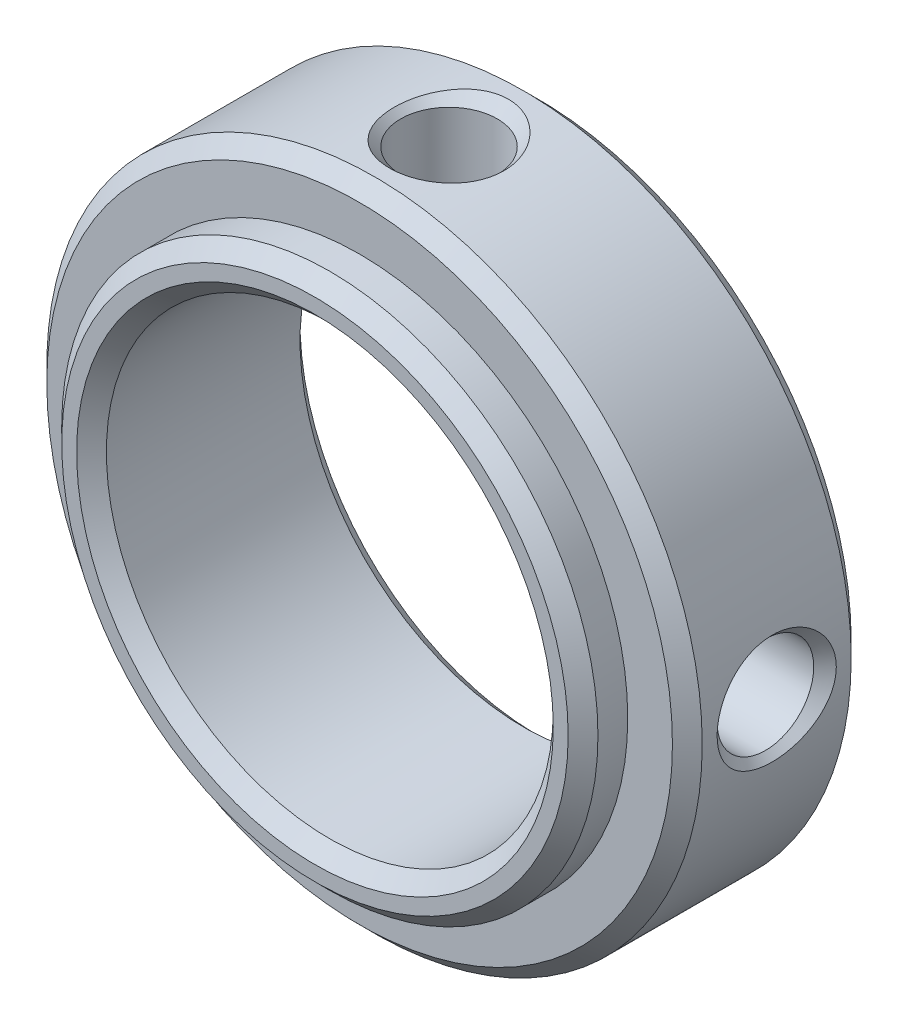
ISO-10303-21;
HEADER;
FILE_DESCRIPTION(('STEP AP214'),'2;1');
FILE_NAME('part.step','',(''),(''),'','','');
FILE_SCHEMA(('AUTOMOTIVE_DESIGN { 1 0 10303 214 1 1 1 1 }'));
ENDSEC;
DATA;
#1=APPLICATION_CONTEXT('core data for automotive mechanical design processes');
#2=APPLICATION_PROTOCOL_DEFINITION('international standard','automotive_design',2000,#1);
#3=PRODUCT_CONTEXT('',#1,'mechanical');
#4=PRODUCT('Part','Part','',(#3));
#5=PRODUCT_RELATED_PRODUCT_CATEGORY('part','',(#4));
#6=PRODUCT_DEFINITION_FORMATION('','',#4);
#7=PRODUCT_DEFINITION_CONTEXT('part definition',#1,'design');
#8=PRODUCT_DEFINITION('design','',#6,#7);
#9=PRODUCT_DEFINITION_SHAPE('','',#8);
#10=(LENGTH_UNIT() NAMED_UNIT(*) SI_UNIT(.MILLI.,.METRE.));
#11=(NAMED_UNIT(*) PLANE_ANGLE_UNIT() SI_UNIT($,.RADIAN.));
#12=(NAMED_UNIT(*) SI_UNIT($,.STERADIAN.) SOLID_ANGLE_UNIT());
#13=UNCERTAINTY_MEASURE_WITH_UNIT(LENGTH_MEASURE(1.E-05),#10,'distance_accuracy_value','');
#14=(GEOMETRIC_REPRESENTATION_CONTEXT(3) GLOBAL_UNCERTAINTY_ASSIGNED_CONTEXT((#13)) GLOBAL_UNIT_ASSIGNED_CONTEXT((#10,
#11,#12)) REPRESENTATION_CONTEXT('',''));
#15=CARTESIAN_POINT('',(0.,0.,0.));
#16=DIRECTION('',(0.,0.,1.));
#17=DIRECTION('',(1.,0.,0.));
#18=AXIS2_PLACEMENT_3D('',#15,#16,#17);
#19=CARTESIAN_POINT('',(0.,0.,-3.));
#20=DIRECTION('',(0.,0.,-1.));
#21=DIRECTION('',(-1.,0.,0.));
#22=AXIS2_PLACEMENT_3D('',#19,#20,#21);
#23=CONICAL_SURFACE('',#22,8.,0.785398163397448);
#24=CARTESIAN_POINT('',(0.,0.,-2.5));
#25=DIRECTION('',(0.,0.,1.));
#26=DIRECTION('',(1.,0.,0.));
#27=AXIS2_PLACEMENT_3D('',#24,#25,#26);
#28=CIRCLE('',#27,7.5);
#29=CARTESIAN_POINT('',(7.5,0.,-2.5));
#30=VERTEX_POINT('',#29);
#31=EDGE_CURVE('E29',#30,#30,#28,.T.);
#32=ORIENTED_EDGE('',*,*,#31,.T.);
#33=EDGE_LOOP('',(#32));
#34=FACE_BOUND('',#33,.T.);
#35=CARTESIAN_POINT('',(0.,0.,-3.));
#36=DIRECTION('',(0.,0.,1.));
#37=DIRECTION('',(1.,0.,0.));
#38=AXIS2_PLACEMENT_3D('',#35,#36,#37);
#39=CIRCLE('',#38,8.);
#40=CARTESIAN_POINT('',(8.,0.,-3.));
#41=VERTEX_POINT('',#40);
#42=EDGE_CURVE('E91',#41,#41,#39,.T.);
#43=ORIENTED_EDGE('',*,*,#42,.F.);
#44=EDGE_LOOP('',(#43));
#45=FACE_BOUND('',#44,.T.);
#46=ADVANCED_FACE('F15',(#34,#45),#23,.F.);
#47=CARTESIAN_POINT('',(0.,0.,4.5));
#48=DIRECTION('',(0.,0.,1.));
#49=DIRECTION('',(1.,0.,0.));
#50=AXIS2_PLACEMENT_3D('',#47,#48,#49);
#51=CYLINDRICAL_SURFACE('',#50,7.5);
#52=CARTESIAN_POINT('',(-1.621,7.32272893121137,0.));
#53=CARTESIAN_POINT('',(-1.62099687236664,7.32273074755098,-0.0899038358625745));
#54=CARTESIAN_POINT('',(-1.61349520286325,7.32440263345071,-0.179845515837992));
#55=CARTESIAN_POINT('',(-1.58371844413528,7.3308975983031,-0.357173021838235));
#56=CARTESIAN_POINT('',(-1.56143251095917,7.33572299024855,-0.444556922626155));
#57=CARTESIAN_POINT('',(-1.50282013140885,7.34795351660353,-0.614178056114049));
#58=CARTESIAN_POINT('',(-1.46650888324879,7.35535585770649,-0.696420748270056));
#59=CARTESIAN_POINT('',(-1.38091985010328,7.37190286922761,-0.853648156121891));
#60=CARTESIAN_POINT('',(-1.33164239719735,7.38104749502218,-0.928633057630876));
#61=CARTESIAN_POINT('',(-1.22065322750415,7.40021725048443,-1.07045492925447));
#62=CARTESIAN_POINT('',(-1.15876811682779,7.41025341748777,-1.137154733643));
#63=CARTESIAN_POINT('',(-1.02469468171418,7.42997873060186,-1.25931229252371));
#64=CARTESIAN_POINT('',(-0.952505568773379,7.4396678500841,-1.31476918587649));
#65=CARTESIAN_POINT('',(-0.798955285124875,7.45772740230315,-1.4134078075145));
#66=CARTESIAN_POINT('',(-0.71750765345234,7.46608329427618,-1.45645783357077));
#67=CARTESIAN_POINT('',(-0.548323405310909,7.48041033248177,-1.5282089369766));
#68=CARTESIAN_POINT('',(-0.46058747884038,7.48638173988661,-1.55691158587922));
#69=CARTESIAN_POINT('',(-0.282742974331054,7.49518899945156,-1.59872239573114));
#70=CARTESIAN_POINT('',(-0.192691303536818,7.49807146720329,-1.61206262991829));
#71=CARTESIAN_POINT('',(-0.0115850834726774,7.50053750692021,-1.62349530622321));
#72=CARTESIAN_POINT('',(0.0794693525241379,7.50012144774877,-1.62158945326035));
#73=CARTESIAN_POINT('',(0.258397295443898,7.4960730092669,-1.60275735457957));
#74=CARTESIAN_POINT('',(0.346298517502574,7.49249419074815,-1.58608123045544));
#75=CARTESIAN_POINT('',(0.518024617183466,7.48258328885811,-1.53858027424522));
#76=CARTESIAN_POINT('',(0.60184931319149,7.47625108294477,-1.50775481242641));
#77=CARTESIAN_POINT('',(0.763739972467913,7.46145845831056,-1.43260746511477));
#78=CARTESIAN_POINT('',(0.841760293571538,7.45298309333397,-1.38819031486463));
#79=CARTESIAN_POINT('',(0.98933138690938,7.43483418327543,-1.28719138842167));
#80=CARTESIAN_POINT('',(1.05888102886029,7.4251604786399,-1.23060799160786));
#81=CARTESIAN_POINT('',(1.18902364998815,7.40544728419828,-1.10551953242376));
#82=CARTESIAN_POINT('',(1.24940588007822,7.39540435600887,-1.03679555870317));
#83=CARTESIAN_POINT('',(1.35782688286461,7.37626912143309,-0.89009346763913));
#84=CARTESIAN_POINT('',(1.4058653367224,7.36717683960542,-0.812115111331925));
#85=CARTESIAN_POINT('',(1.48832577105213,7.35096359644511,-0.648782520034576));
#86=CARTESIAN_POINT('',(1.52270874523353,7.34384829943056,-0.563407992425257));
#87=CARTESIAN_POINT('',(1.57657691503288,7.33247373352837,-0.387902891037021));
#88=CARTESIAN_POINT('',(1.59606441241388,7.3282140233861,-0.297773054386876));
#89=CARTESIAN_POINT('',(1.61926326986101,7.32312270378733,-0.117239257328509));
#90=CARTESIAN_POINT('',(1.62328113417857,7.32222450198077,-0.0268765154705693));
#91=CARTESIAN_POINT('',(1.61625577521256,7.32377838762239,0.153227664366256));
#92=CARTESIAN_POINT('',(1.60521356030278,7.32623025076116,0.242969143538506));
#93=CARTESIAN_POINT('',(1.56864718351558,7.33414519360751,0.41822145313416));
#94=CARTESIAN_POINT('',(1.5432911134889,7.33957330151173,0.503769080808493));
#95=CARTESIAN_POINT('',(1.47899846855692,7.35279770153091,0.669401700714547));
#96=CARTESIAN_POINT('',(1.44006061911023,7.36059421589302,0.749486179429876));
#97=CARTESIAN_POINT('',(1.34903178597356,7.37782373838975,0.903247721167944));
#98=CARTESIAN_POINT('',(1.29675156341682,7.38727962196052,0.976810136907439));
#99=CARTESIAN_POINT('',(1.18077030536178,7.4067017688108,1.11423012816817));
#100=CARTESIAN_POINT('',(1.11706788664852,7.41666809379965,1.17808652656934));
#101=CARTESIAN_POINT('',(0.978665103225349,7.43620719928019,1.29546756476529));
#102=CARTESIAN_POINT('',(0.903785998424953,7.445769544032,1.34878348370804));
#103=CARTESIAN_POINT('',(0.74595612924001,7.46323280070106,1.4420792704132));
#104=CARTESIAN_POINT('',(0.663005737173231,7.47113378920138,1.48205975294522));
#105=CARTESIAN_POINT('',(0.491898378416219,7.48434002033288,1.5472571400718));
#106=CARTESIAN_POINT('',(0.403777863816973,7.48966144552783,1.57256628504769));
#107=CARTESIAN_POINT('',(0.224408131078985,7.49717886050936,1.60799126930778));
#108=CARTESIAN_POINT('',(0.133159358352864,7.49937529336638,1.61810926244856));
#109=CARTESIAN_POINT('',(-0.0478935289421169,7.50038247343381,1.62276980444035));
#110=CARTESIAN_POINT('',(-0.137689379230273,7.49926102762408,1.61762428565347));
#111=CARTESIAN_POINT('',(-0.31510426041437,7.49390334552127,1.59260030460621));
#112=CARTESIAN_POINT('',(-0.402723328632754,7.48966716267067,1.5727220951285));
#113=CARTESIAN_POINT('',(-0.573062893252121,7.47856056394689,1.51894498186718));
#114=CARTESIAN_POINT('',(-0.655797617605823,7.47169828433068,1.48508935806674));
#115=CARTESIAN_POINT('',(-0.814454218365362,7.45607313482181,1.40436102898102));
#116=CARTESIAN_POINT('',(-0.890375449499734,7.44731008518481,1.35748709251489));
#117=CARTESIAN_POINT('',(-1.03477452928929,7.4286369304158,1.25103054851702));
#118=CARTESIAN_POINT('',(-1.10308789851819,7.41870854037186,1.19122802531061));
#119=CARTESIAN_POINT('',(-1.22881638351513,7.39892360597008,1.06105668579895));
#120=CARTESIAN_POINT('',(-1.2862288761733,7.38906707945227,0.990685333563157));
#121=CARTESIAN_POINT('',(-1.38924285771343,7.37039943057237,0.840275180538975));
#122=CARTESIAN_POINT('',(-1.43468127884454,7.36160354680109,0.76012270056957));
#123=CARTESIAN_POINT('',(-1.51137113605772,7.34624385532937,0.593147113198116));
#124=CARTESIAN_POINT('',(-1.542634704209,7.33967814006926,0.506329784863596));
#125=CARTESIAN_POINT('',(-1.5844362734669,7.33075008990193,0.349506511262758));
#126=CARTESIAN_POINT('',(-1.59812163356967,7.32776192602792,0.280357894734531));
#127=CARTESIAN_POINT('',(-1.61640451054976,7.32375068100641,0.140813885918481));
#128=CARTESIAN_POINT('',(-1.62100244976657,7.32272750853564,0.0704185517255065));
#129=CARTESIAN_POINT('',(-1.621,7.32272893121137,0.));
#130=B_SPLINE_CURVE_WITH_KNOTS('',3,(#52,#53,#54,#55,#56,#57,#58,#59,#60,#61,#62,#63,#64,#65,
#66,#67,#68,#69,#70,#71,#72,#73,#74,#75,#76,#77,#78,#79,#80,#81,#82,#83,#84,#85,#86,#87,#88,#89,
#90,#91,#92,#93,#94,#95,#96,#97,#98,#99,#100,#101,#102,#103,#104,#105,#106,#107,#108,#109,#110,
#111,#112,#113,#114,#115,#116,#117,#118,#119,#120,#121,#122,#123,#124,#125,#126,#127,#128,#129),
.UNSPECIFIED.,.T.,.F.,(4,2,2,2,2,2,2,2,2,2,2,2,2,2,2,2,2,2,2,2,2,2,2,2,2,2,2,2,2,2,2,2,2,2,2,2,
2,2,4),(0.,0.269453464649487,0.539104786683699,0.808464723262258,1.07781776189232,
1.35116116499291,1.62452549665166,1.90069294077778,2.17683012801864,2.44873872762555,
2.72061692102029,2.98797728790134,3.25534955512041,3.52464052213471,3.79396738265696,
4.0687677074855,4.34357512966591,4.61916197699945,4.89470622993058,5.16476207561093,
5.43479984012017,5.70173053706739,5.96868629006797,6.23966203816783,6.51067062331217,
6.78660152113874,7.06251969666802,7.33668378321192,7.61080899410578,7.87937090270987,
8.14792820345072,8.41566010089163,8.68341732716756,8.95614875557996,9.2289457292109,
9.50528541314957,9.78138813305378,9.9924514815969,10.2035050207033),.UNSPECIFIED.);
#131=CARTESIAN_POINT('',(-1.621,7.32272893121137,0.));
#132=VERTEX_POINT('',#131);
#133=EDGE_CURVE('E18',#132,#132,#130,.T.);
#134=ORIENTED_EDGE('',*,*,#133,.F.);
#135=EDGE_LOOP('',(#134));
#136=FACE_BOUND('',#135,.T.);
#137=CARTESIAN_POINT('',(7.5,0.,-1.621));
#138=CARTESIAN_POINT('',(7.49999833810788,-0.0899314929735589,-1.62099689238378));
#139=CARTESIAN_POINT('',(7.49836600468388,-0.179900779898295,-1.61349076352164));
#140=CARTESIAN_POINT('',(7.49201193669874,-0.357285594074729,-1.58369468834428));
#141=CARTESIAN_POINT('',(7.48728795915008,-0.444699219056534,-1.56139400842282));
#142=CARTESIAN_POINT('',(7.47527679942892,-0.614383330214406,-1.50273852208998));
#143=CARTESIAN_POINT('',(7.46799226375417,-0.696659023758527,-1.46639822267946));
#144=CARTESIAN_POINT('',(7.45164700786165,-0.853942151469209,-1.38074069125602));
#145=CARTESIAN_POINT('',(7.44258634209633,-0.92894980835336,-1.33142385706084));
#146=CARTESIAN_POINT('',(7.42352312985904,-1.07074776011569,-1.22039416184727));
#147=CARTESIAN_POINT('',(7.41350913151168,-1.13740768843006,-1.15851675897419));
#148=CARTESIAN_POINT('',(7.39374895765789,-1.25948777986185,-1.02447570877459));
#149=CARTESIAN_POINT('',(7.38400280565095,-1.3149069594768,-0.952311162320491));
#150=CARTESIAN_POINT('',(7.36576906987366,-1.41350468468729,-0.79878415689914));
#151=CARTESIAN_POINT('',(7.35729616931915,-1.45654498916367,-0.717331017651804));
#152=CARTESIAN_POINT('',(7.34273240064218,-1.52827662247175,-0.548134883630957));
#153=CARTESIAN_POINT('',(7.33664125492316,-1.55696962360866,-0.460392623273924));
#154=CARTESIAN_POINT('',(7.32764718154206,-1.59876240233554,-0.282521467454403));
#155=CARTESIAN_POINT('',(7.32469717288754,-1.61209270189128,-0.192449166898616));
#156=CARTESIAN_POINT('',(7.32217794011491,-1.62349835014945,-0.0113020157484732));
#157=CARTESIAN_POINT('',(7.32260831057539,-1.62157552821508,0.0797727133126032));
#158=CARTESIAN_POINT('',(7.32675856369929,-1.60271515061745,0.258629624380841));
#159=CARTESIAN_POINT('',(7.33041988576599,-1.58604487732737,0.346441555505378));
#160=CARTESIAN_POINT('',(7.3405269706189,-1.53858603715042,0.517992159963854));
#161=CARTESIAN_POINT('',(7.34697288631347,-1.50779669494774,0.601730609332677));
#162=CARTESIAN_POINT('',(7.36198088338595,-1.43272689280511,0.763511319124397));
#163=CARTESIAN_POINT('',(7.37055905841154,-1.38834320624575,0.841504125054169));
#164=CARTESIAN_POINT('',(7.38885509403028,-1.28741722368653,0.989034080557055));
#165=CARTESIAN_POINT('',(7.39857310642592,-1.23087330736069,1.05857010134573));
#166=CARTESIAN_POINT('',(7.41830545309564,-1.10581475820065,1.18875194586542));
#167=CARTESIAN_POINT('',(7.42832171327747,-1.03707272326524,1.24917923583245));
#168=CARTESIAN_POINT('',(7.44733510256351,-0.890317818144699,1.35768280518281));
#169=CARTESIAN_POINT('',(7.45633221403998,-0.812304787651271,1.40575887095098));
#170=CARTESIAN_POINT('',(7.47232170512563,-0.648959101937615,1.48824732691425));
#171=CARTESIAN_POINT('',(7.47930995227258,-0.563611820936575,1.52263160670113));
#172=CARTESIAN_POINT('',(7.49046353006128,-0.388166457699895,1.57651055026927));
#173=CARTESIAN_POINT('',(7.494629261303,-0.298069051607229,1.59600732708517));
#174=CARTESIAN_POINT('',(7.49961159850132,-0.117555979303208,1.61924118363555));
#175=CARTESIAN_POINT('',(7.50049165140035,-0.0271804463426039,1.623276860089));
#176=CARTESIAN_POINT('',(7.49898104450762,0.152953435739122,1.61628254749559));
#177=CARTESIAN_POINT('',(7.49659060105623,0.242711825289001,1.60525355496293));
#178=CARTESIAN_POINT('',(7.48884758688727,0.418077901607162,1.5686906508059));
#179=CARTESIAN_POINT('',(7.48352691551364,0.503719673274276,1.54331286649004));
#180=CARTESIAN_POINT('',(7.4705187799409,0.669531084522397,1.47894566971032));
#181=CARTESIAN_POINT('',(7.46283111741517,0.749700264875322,1.43995511661648));
#182=CARTESIAN_POINT('',(7.44578499097477,0.903529022984988,1.34884363413632));
#183=CARTESIAN_POINT('',(7.43640465979558,0.977081856415358,1.29654666366321));
#184=CARTESIAN_POINT('',(7.41705926459442,1.11447484877189,1.18053923502465));
#185=CARTESIAN_POINT('',(7.40709412665213,1.17831377616806,1.11682733189873));
#186=CARTESIAN_POINT('',(7.38748385525495,1.29564332826544,0.978429883884926));
#187=CARTESIAN_POINT('',(7.37784768735553,1.34892743267108,0.903567753396743));
#188=CARTESIAN_POINT('',(7.36019117363825,1.44216743094426,0.745781652404031));
#189=CARTESIAN_POINT('',(7.35217075849948,1.48212389665801,0.662858027989555));
#190=CARTESIAN_POINT('',(7.33872925368961,1.54730786220703,0.49174471835222));
#191=CARTESIAN_POINT('',(7.33329371463104,1.5726174146328,0.403587481057942));
#192=CARTESIAN_POINT('',(7.32561063740287,1.60803082512366,0.22413919180621));
#193=CARTESIAN_POINT('',(7.32336260323174,1.61813704896452,0.132848629684289));
#194=CARTESIAN_POINT('',(7.32233979570647,1.62275809168936,-0.0481939339952275));
#195=CARTESIAN_POINT('',(7.32349211403651,1.61760018796114,-0.137937325601936));
#196=CARTESIAN_POINT('',(7.32897557201404,1.59256970342796,-0.315243949860029));
#197=CARTESIAN_POINT('',(7.33330667601629,1.57269728762383,-0.402807206946921));
#198=CARTESIAN_POINT('',(7.34462457311079,1.5189583046108,-0.573015407715132));
#199=CARTESIAN_POINT('',(7.35160252469684,1.48513829536009,-0.655675677679699));
#200=CARTESIAN_POINT('',(7.36743155443606,1.40450455189394,-0.814197859648514));
#201=CARTESIAN_POINT('',(7.37628282238814,1.35768950090919,-0.890059081683754));
#202=CARTESIAN_POINT('',(7.39507972326147,1.2513044320779,-1.03444545913128));
#203=CARTESIAN_POINT('',(7.40504352032341,1.19150072078826,-1.10279609525833));
#204=CARTESIAN_POINT('',(7.42481959641205,1.0613108414436,-1.22859920915741));
#205=CARTESIAN_POINT('',(7.43463183992538,0.990922233315806,-1.28604916713674));
#206=CARTESIAN_POINT('',(7.45314577912645,0.840492059252322,-1.38911195136018));
#207=CARTESIAN_POINT('',(7.46183192197475,0.760340028496653,-1.43456648800203));
#208=CARTESIAN_POINT('',(7.47695940792012,0.593363650279832,-1.51128659215852));
#209=CARTESIAN_POINT('',(7.48340265291211,0.506545032475193,-1.54256418803111));
#210=CARTESIAN_POINT('',(7.49215397209867,0.349686283256488,-1.58439839201087));
#211=CARTESIAN_POINT('',(7.49507815419989,0.28050148245364,-1.59809805708761));
#212=CARTESIAN_POINT('',(7.49900177836725,0.140885484504292,-1.61639988568959));
#213=CARTESIAN_POINT('',(7.5000013019634,0.0704543402814229,-1.62100243457596));
#214=CARTESIAN_POINT('',(7.5,0.,-1.621));
#215=B_SPLINE_CURVE_WITH_KNOTS('',3,(#137,#138,#139,#140,#141,#142,#143,#144,#145,#146,#147,
#148,#149,#150,#151,#152,#153,#154,#155,#156,#157,#158,#159,#160,#161,#162,#163,#164,#165,#166,
#167,#168,#169,#170,#171,#172,#173,#174,#175,#176,#177,#178,#179,#180,#181,#182,#183,#184,#185,
#186,#187,#188,#189,#190,#191,#192,#193,#194,#195,#196,#197,#198,#199,#200,#201,#202,#203,#204,
#205,#206,#207,#208,#209,#210,#211,#212,#213,#214),.UNSPECIFIED.,.T.,.F.,(4,2,2,2,2,2,2,2,2,2,2,
2,2,2,2,2,2,2,2,2,2,2,2,2,2,2,2,2,2,2,2,2,2,2,2,2,2,2,4),(0.,0.269536609268199,0.53926898442066,
0.808723389996911,1.07816953595238,1.35140416439622,1.62466268903518,1.90086382679384,
2.17703276335587,2.44900141443264,2.7209374477977,2.98804364100945,3.25516450349304,
3.52436622180582,3.79360383295227,4.06852218633743,4.34344529413179,4.6189299678167,
4.89437553374024,5.1644738498514,5.43455430006884,5.70175108298497,5.96897026001094,
6.23992735296159,6.51091876930952,6.78677875189212,7.06262689668492,7.33691438490591,
7.61115918709021,7.87956681581584,8.14797143480441,8.41548726221797,8.68303020653547,
8.95585819469173,9.2287491729354,9.50507900860769,9.7811739526583,9.99234389817661,
10.2035048981754),.UNSPECIFIED.);
#216=CARTESIAN_POINT('',(7.5,0.,-1.621));
#217=VERTEX_POINT('',#216);
#218=EDGE_CURVE('E36',#217,#217,#215,.T.);
#219=ORIENTED_EDGE('',*,*,#218,.F.);
#220=EDGE_LOOP('',(#219));
#221=FACE_BOUND('',#220,.T.);
#222=CARTESIAN_POINT('',(0.,0.,4.));
#223=DIRECTION('',(0.,0.,1.));
#224=DIRECTION('',(1.,0.,0.));
#225=AXIS2_PLACEMENT_3D('',#222,#223,#224);
#226=CIRCLE('',#225,7.5);
#227=CARTESIAN_POINT('',(7.5,0.,4.));
#228=VERTEX_POINT('',#227);
#229=EDGE_CURVE('E64',#228,#228,#226,.T.);
#230=ORIENTED_EDGE('',*,*,#229,.T.);
#231=EDGE_LOOP('',(#230));
#232=FACE_BOUND('',#231,.T.);
#233=ORIENTED_EDGE('',*,*,#31,.F.);
#234=EDGE_LOOP('',(#233));
#235=FACE_BOUND('',#234,.T.);
#236=ADVANCED_FACE('F104',(#136,#221,#232,#235),#51,.F.);
#237=CARTESIAN_POINT('',(0.,0.,4.));
#238=DIRECTION('',(0.,0.,1.));
#239=DIRECTION('',(1.,0.,0.));
#240=AXIS2_PLACEMENT_3D('',#237,#238,#239);
#241=CONICAL_SURFACE('',#240,7.5,0.78539816339745);
#242=CARTESIAN_POINT('',(0.,0.,4.5));
#243=DIRECTION('',(0.,0.,1.));
#244=DIRECTION('',(1.,0.,0.));
#245=AXIS2_PLACEMENT_3D('',#242,#243,#244);
#246=CIRCLE('',#245,8.);
#247=CARTESIAN_POINT('',(8.,0.,4.5));
#248=VERTEX_POINT('',#247);
#249=EDGE_CURVE('E67',#248,#248,#246,.T.);
#250=ORIENTED_EDGE('',*,*,#249,.T.);
#251=EDGE_LOOP('',(#250));
#252=FACE_BOUND('',#251,.T.);
#253=ORIENTED_EDGE('',*,*,#229,.F.);
#254=EDGE_LOOP('',(#253));
#255=FACE_BOUND('',#254,.T.);
#256=ADVANCED_FACE('F107',(#252,#255),#241,.F.);
#257=CARTESIAN_POINT('',(8.,0.,4.5));
#258=DIRECTION('',(0.,0.,1.));
#259=DIRECTION('',(1.,0.,0.));
#260=AXIS2_PLACEMENT_3D('',#257,#258,#259);
#261=PLANE('',#260);
#262=CARTESIAN_POINT('',(0.,0.,4.5));
#263=DIRECTION('',(0.,0.,1.));
#264=DIRECTION('',(1.,0.,0.));
#265=AXIS2_PLACEMENT_3D('',#262,#263,#264);
#266=CIRCLE('',#265,8.5);
#267=CARTESIAN_POINT('',(8.5,0.,4.5));
#268=VERTEX_POINT('',#267);
#269=EDGE_CURVE('E70',#268,#268,#266,.T.);
#270=ORIENTED_EDGE('',*,*,#269,.T.);
#271=EDGE_LOOP('',(#270));
#272=FACE_BOUND('',#271,.T.);
#273=ORIENTED_EDGE('',*,*,#249,.F.);
#274=EDGE_LOOP('',(#273));
#275=FACE_BOUND('',#274,.T.);
#276=ADVANCED_FACE('F154',(#272,#275),#261,.T.);
#277=CARTESIAN_POINT('',(0.,0.,4.5));
#278=DIRECTION('',(0.,0.,-1.));
#279=DIRECTION('',(-1.,0.,0.));
#280=AXIS2_PLACEMENT_3D('',#277,#278,#279);
#281=CONICAL_SURFACE('',#280,8.5,0.785398163397448);
#282=CARTESIAN_POINT('',(0.,0.,4.));
#283=DIRECTION('',(0.,0.,1.));
#284=DIRECTION('',(1.,0.,0.));
#285=AXIS2_PLACEMENT_3D('',#282,#283,#284);
#286=CIRCLE('',#285,9.);
#287=CARTESIAN_POINT('',(9.,0.,4.));
#288=VERTEX_POINT('',#287);
#289=EDGE_CURVE('E73',#288,#288,#286,.T.);
#290=ORIENTED_EDGE('',*,*,#289,.T.);
#291=EDGE_LOOP('',(#290));
#292=FACE_BOUND('',#291,.T.);
#293=ORIENTED_EDGE('',*,*,#269,.F.);
#294=EDGE_LOOP('',(#293));
#295=FACE_BOUND('',#294,.T.);
#296=ADVANCED_FACE('F148',(#292,#295),#281,.T.);
#297=CARTESIAN_POINT('',(0.,0.,4.5));
#298=DIRECTION('',(0.,0.,1.));
#299=DIRECTION('',(1.,0.,0.));
#300=AXIS2_PLACEMENT_3D('',#297,#298,#299);
#301=CYLINDRICAL_SURFACE('',#300,9.);
#302=CARTESIAN_POINT('',(0.,0.,3.));
#303=DIRECTION('',(0.,0.,1.));
#304=DIRECTION('',(1.,0.,0.));
#305=AXIS2_PLACEMENT_3D('',#302,#303,#304);
#306=CIRCLE('',#305,9.);
#307=CARTESIAN_POINT('',(9.,0.,3.));
#308=VERTEX_POINT('',#307);
#309=EDGE_CURVE('E76',#308,#308,#306,.T.);
#310=ORIENTED_EDGE('',*,*,#309,.T.);
#311=EDGE_LOOP('',(#310));
#312=FACE_BOUND('',#311,.T.);
#313=ORIENTED_EDGE('',*,*,#289,.F.);
#314=EDGE_LOOP('',(#313));
#315=FACE_BOUND('',#314,.T.);
#316=ADVANCED_FACE('F142',(#312,#315),#301,.T.);
#317=CARTESIAN_POINT('',(9.,0.,3.));
#318=DIRECTION('',(0.,0.,1.));
#319=DIRECTION('',(1.,0.,0.));
#320=AXIS2_PLACEMENT_3D('',#317,#318,#319);
#321=PLANE('',#320);
#322=CARTESIAN_POINT('',(0.,0.,3.));
#323=DIRECTION('',(0.,0.,1.));
#324=DIRECTION('',(1.,0.,0.));
#325=AXIS2_PLACEMENT_3D('',#322,#323,#324);
#326=CIRCLE('',#325,10.5);
#327=CARTESIAN_POINT('',(10.5,0.,3.));
#328=VERTEX_POINT('',#327);
#329=EDGE_CURVE('E79',#328,#328,#326,.T.);
#330=ORIENTED_EDGE('',*,*,#329,.T.);
#331=EDGE_LOOP('',(#330));
#332=FACE_BOUND('',#331,.T.);
#333=ORIENTED_EDGE('',*,*,#309,.F.);
#334=EDGE_LOOP('',(#333));
#335=FACE_BOUND('',#334,.T.);
#336=ADVANCED_FACE('F137',(#332,#335),#321,.T.);
#337=CARTESIAN_POINT('',(0.,0.,3.));
#338=DIRECTION('',(0.,0.,-1.));
#339=DIRECTION('',(-1.,0.,0.));
#340=AXIS2_PLACEMENT_3D('',#337,#338,#339);
#341=CONICAL_SURFACE('',#340,10.5,0.785398163397448);
#342=CARTESIAN_POINT('',(0.,0.,2.5));
#343=DIRECTION('',(0.,0.,1.));
#344=DIRECTION('',(1.,0.,0.));
#345=AXIS2_PLACEMENT_3D('',#342,#343,#344);
#346=CIRCLE('',#345,11.);
#347=CARTESIAN_POINT('',(11.,0.,2.5));
#348=VERTEX_POINT('',#347);
#349=EDGE_CURVE('E82',#348,#348,#346,.T.);
#350=ORIENTED_EDGE('',*,*,#349,.T.);
#351=EDGE_LOOP('',(#350));
#352=FACE_BOUND('',#351,.T.);
#353=ORIENTED_EDGE('',*,*,#329,.F.);
#354=EDGE_LOOP('',(#353));
#355=FACE_BOUND('',#354,.T.);
#356=ADVANCED_FACE('F131',(#352,#355),#341,.T.);
#357=CARTESIAN_POINT('',(0.,0.,4.5));
#358=DIRECTION('',(0.,0.,1.));
#359=DIRECTION('',(1.,0.,0.));
#360=AXIS2_PLACEMENT_3D('',#357,#358,#359);
#361=CYLINDRICAL_SURFACE('',#360,11.);
#362=CARTESIAN_POINT('',(-1.3492836294301,10.9169333537251,-1.36164133675904));
#363=CARTESIAN_POINT('',(-1.41082061310597,10.9093279613915,-1.28995341706873));
#364=CARTESIAN_POINT('',(-1.46717263206603,10.901835997752,-1.21377965180805));
#365=CARTESIAN_POINT('',(-1.56872798879297,10.8876868843545,-1.05421309908477));
#366=CARTESIAN_POINT('',(-1.6139213068992,10.8810304874886,-0.970813913848449));
#367=CARTESIAN_POINT('',(-1.70032591409093,10.8678966837175,-0.7814884598093));
#368=CARTESIAN_POINT('',(-1.73898584691012,10.8617145364246,-0.674367176046878));
#369=CARTESIAN_POINT('',(-1.79874902797684,10.8519777328353,-0.455208955130269));
#370=CARTESIAN_POINT('',(-1.81984482476393,10.8484241917778,-0.343169952866298));
#371=CARTESIAN_POINT('',(-1.84459652874375,10.8442443972488,-0.112561317286336));
#372=CARTESIAN_POINT('',(-1.84751904774362,10.8437412633565,0.00609001827912036));
#373=CARTESIAN_POINT('',(-1.8339073147683,10.8460512655655,0.242242107148554));
#374=CARTESIAN_POINT('',(-1.8173717302247,10.8488646287937,0.359742781094944));
#375=CARTESIAN_POINT('',(-1.76487464354884,10.8575286903505,0.591500523965542));
#376=CARTESIAN_POINT('',(-1.72871433368389,10.863410448919,0.705711577053104));
#377=CARTESIAN_POINT('',(-1.63751227396604,10.8775306169766,0.926207074252609));
#378=CARTESIAN_POINT('',(-1.58246966494144,10.8857691336988,1.0324911574081));
#379=CARTESIAN_POINT('',(-1.45586168167135,10.9034149895592,1.23167852201217));
#380=CARTESIAN_POINT('',(-1.38464441572207,10.9127960058526,1.32480477085175));
#381=CARTESIAN_POINT('',(-1.22662907151176,10.9316827197757,1.49676703477197));
#382=CARTESIAN_POINT('',(-1.13983629294287,10.9411883739799,1.57560789228976));
#383=CARTESIAN_POINT('',(-0.9585464620262,10.9585107940693,1.71141087832306));
#384=CARTESIAN_POINT('',(-0.864833029461631,10.9663949395353,1.76940797607905));
#385=CARTESIAN_POINT('',(-0.668205522194958,10.9801262623692,1.86718691795925));
#386=CARTESIAN_POINT('',(-0.565298036155137,10.9859748839559,1.9069816830944));
#387=CARTESIAN_POINT('',(-0.362905167730333,10.9944373614955,1.96370433556059));
#388=CARTESIAN_POINT('',(-0.263901900711497,10.9972885163603,1.98232145950467));
#389=CARTESIAN_POINT('',(-0.0641342153755352,11.0002657186349,2.00175085113628));
#390=CARTESIAN_POINT('',(0.0366294889716554,11.0003928462627,2.00257017657573));
#391=CARTESIAN_POINT('',(0.230937864609057,10.9979806882912,1.98684462979057));
#392=CARTESIAN_POINT('',(0.324566474761897,10.9955930774793,1.97128752089055));
#393=CARTESIAN_POINT('',(0.507901413741853,10.9886512173872,1.92501839829064));
#394=CARTESIAN_POINT('',(0.597607665536063,10.9840969255755,1.89430608709653));
#395=CARTESIAN_POINT('',(0.771949077889507,10.9732325079528,1.81847886442203));
#396=CARTESIAN_POINT('',(0.856504039450177,10.9669005221812,1.77318353953957));
#397=CARTESIAN_POINT('',(1.01740084693456,10.9531469340918,1.66996219354784));
#398=CARTESIAN_POINT('',(1.09374054446384,10.9457250479457,1.61203288042199));
#399=CARTESIAN_POINT('',(1.24168469261407,10.9299649840931,1.48099225874179));
#400=CARTESIAN_POINT('',(1.31260397897597,10.9215988831267,1.40711156759953));
#401=CARTESIAN_POINT('',(1.44214359242645,10.9052507710546,1.2492287907593));
#402=CARTESIAN_POINT('',(1.50075956761839,10.8972688966233,1.16522314017029));
#403=CARTESIAN_POINT('',(1.60899414031821,10.8818369584083,0.98213347869874));
#404=CARTESIAN_POINT('',(1.6574933824812,10.8744829315144,0.882378815157412));
#405=CARTESIAN_POINT('',(1.73819699961907,10.8618757063704,0.676358720147819));
#406=CARTESIAN_POINT('',(1.77039683802939,10.8566230930857,0.570091485270995));
#407=CARTESIAN_POINT('',(1.81930188866519,10.8485391071754,0.347692490768041));
#408=CARTESIAN_POINT('',(1.83503948254352,10.8458596293027,0.231341459118881));
#409=CARTESIAN_POINT('',(1.84746138788251,10.8437504951471,-0.00240869310170386));
#410=CARTESIAN_POINT('',(1.84414275689591,10.8443213407425,-0.119807972737352));
#411=CARTESIAN_POINT('',(1.81824191363019,10.8486945547927,-0.354860967114986));
#412=CARTESIAN_POINT('',(1.79526509722108,10.8525631132862,-0.472470299266981));
#413=CARTESIAN_POINT('',(1.72994389162694,10.863166245689,-0.70207057036993));
#414=CARTESIAN_POINT('',(1.68759799737371,10.8699010423155,-0.81406107196082));
#415=CARTESIAN_POINT('',(1.58480026213746,10.8853606205722,-1.02805750197134));
#416=CARTESIAN_POINT('',(1.52451097664203,10.8940673750676,-1.13014259823741));
#417=CARTESIAN_POINT('',(1.38689253222609,10.9124392139516,-1.3220445934458));
#418=CARTESIAN_POINT('',(1.30956624652403,10.9221041365983,-1.41186355688749));
#419=CARTESIAN_POINT('',(1.14355419936728,10.9407002764389,-1.57200753859684));
#420=CARTESIAN_POINT('',(1.055551983829,10.9496448149119,-1.64303763052559));
#421=CARTESIAN_POINT('',(0.867887061725606,10.9661116697563,-1.76775862679924));
#422=CARTESIAN_POINT('',(0.768231967442821,10.9736349062876,-1.82146076542802));
#423=CARTESIAN_POINT('',(0.568980893389442,10.9856896860779,-1.90522662894712));
#424=CARTESIAN_POINT('',(0.470066042413365,10.9904176606209,-1.93688195154097));
#425=CARTESIAN_POINT('',(0.268070547236925,10.9971959982428,-1.98181899189524));
#426=CARTESIAN_POINT('',(0.164992333350724,10.9992479008083,-1.99511127377887));
#427=CARTESIAN_POINT('',(-0.0341775269000487,11.0003644475378,-2.00236840844775));
#428=CARTESIAN_POINT('',(-0.130221024692109,10.999639138965,-1.99769216678217));
#429=CARTESIAN_POINT('',(-0.320097670323392,10.9957515843987,-1.97223983581264));
#430=CARTESIAN_POINT('',(-0.41393079884194,10.9925893171121,-1.95146360583361));
#431=CARTESIAN_POINT('',(-0.595691533925438,10.9842317342697,-1.89506333538895));
#432=CARTESIAN_POINT('',(-0.683675083819792,10.9790604645868,-1.85961459443566));
#433=CARTESIAN_POINT('',(-0.85278496098809,10.9672214650055,-1.77527627062267));
#434=CARTESIAN_POINT('',(-0.933913320691089,10.960554180804,-1.72639068993153));
#435=CARTESIAN_POINT('',(-1.07326784022272,10.9476960012809,-1.62710734649395));
#436=CARTESIAN_POINT('',(-1.13294121319186,10.9416487677843,-1.57869789880167));
#437=CARTESIAN_POINT('',(-1.24597526216931,10.9293538705181,-1.47505681126315));
#438=CARTESIAN_POINT('',(-1.29933729912539,10.9231062503297,-1.4198266474751));
#439=CARTESIAN_POINT('',(-1.3492836294301,10.9169333537251,-1.36164133675904));
#440=B_SPLINE_CURVE_WITH_KNOTS('',3,(#362,#363,#364,#365,#366,#367,#368,#369,#370,#371,#372,
#373,#374,#375,#376,#377,#378,#379,#380,#381,#382,#383,#384,#385,#386,#387,#388,#389,#390,#391,
#392,#393,#394,#395,#396,#397,#398,#399,#400,#401,#402,#403,#404,#405,#406,#407,#408,#409,#410,
#411,#412,#413,#414,#415,#416,#417,#418,#419,#420,#421,#422,#423,#424,#425,#426,#427,#428,#429,
#430,#431,#432,#433,#434,#435,#436,#437,#438,#439),.UNSPECIFIED.,.T.,.F.,(4,2,2,2,2,2,2,2,2,2,2,
2,2,2,2,2,2,2,2,2,2,2,2,2,2,2,2,2,2,2,2,2,2,2,2,2,2,2,4),(0.,0.284144737053099,
0.568543694019487,0.909138581252306,1.2498778899353,1.60428309550878,1.95871257357439,
2.31680149737037,2.67490671688783,3.02593335170585,3.37684077260235,3.70652161075111,
4.0359680588356,4.33673148506304,4.6373756407852,4.9208714853045,5.2043728950237,
5.49152586352725,5.77875374457214,6.0857057482171,6.39276614387071,6.72479776007347,
7.05692173890555,7.40762623800704,7.75838489039678,8.1163541821208,8.47435129446477,
8.82919909778646,9.18398710326208,9.52250506178835,9.8608031048992,10.171032440834,
10.4810832296709,10.7681641056421,11.0552474900358,11.3389956648036,11.6226594164659,
11.853334574758,12.0839599002688),.UNSPECIFIED.);
#441=CARTESIAN_POINT('',(-1.3492836294301,10.9169333537251,-1.36164133675904));
#442=VERTEX_POINT('',#441);
#443=EDGE_CURVE('E10',#442,#442,#440,.T.);
#444=ORIENTED_EDGE('',*,*,#443,.F.);
#445=EDGE_LOOP('',(#444));
#446=FACE_BOUND('',#445,.T.);
#447=CARTESIAN_POINT('',(10.9169333537251,-1.3492836294301,-1.36164133675904));
#448=CARTESIAN_POINT('',(10.9245530019425,-1.28763020891823,-1.4334635687449));
#449=CARTESIAN_POINT('',(10.9322882654621,-1.22075987030891,-1.50079542389781));
#450=CARTESIAN_POINT('',(10.9473250223153,-1.0776139844693,-1.62472483469979));
#451=CARTESIAN_POINT('',(10.9546263936283,-1.00133580991041,-1.68131938048635));
#452=CARTESIAN_POINT('',(10.9689630661688,-0.830690933601631,-1.78831612408063));
#453=CARTESIAN_POINT('',(10.9758502386167,-0.73525539142715,-1.83705234514816));
#454=CARTESIAN_POINT('',(10.987333726128,-0.536967135339002,-1.91638301250983));
#455=CARTESIAN_POINT('',(10.9919305296956,-0.434116008429719,-1.94698132763556));
#456=CARTESIAN_POINT('',(10.9979660907136,-0.232601429203861,-1.98682487819857));
#457=CARTESIAN_POINT('',(10.999622905258,-0.134235611938899,-1.99754743189414));
#458=CARTESIAN_POINT('',(11.0002612744429,0.0628487258756453,-2.00169966828308));
#459=CARTESIAN_POINT('',(10.9992437804628,0.161567108523318,-1.99513550068844));
#460=CARTESIAN_POINT('',(10.994759385023,0.352087421169566,-1.96570252138775));
#461=CARTESIAN_POINT('',(10.9914000496321,0.444004002977928,-1.94354934167154));
#462=CARTESIAN_POINT('',(10.9827132316743,0.622928752094632,-1.88466576059149));
#463=CARTESIAN_POINT('',(10.977385565366,0.70993646029101,-1.84793399831014));
#464=CARTESIAN_POINT('',(10.9651384192008,0.879291982159531,-1.76009248161161));
#465=CARTESIAN_POINT('',(10.95817906234,0.961444893885135,-1.7086138625223));
#466=CARTESIAN_POINT('',(10.9434520059558,1.11666880785923,-1.59353217295876));
#467=CARTESIAN_POINT('',(10.9356840689246,1.18973712774099,-1.52992553547808));
#468=CARTESIAN_POINT('',(10.91947364256,1.33060194651987,-1.38729640873683));
#469=CARTESIAN_POINT('',(10.9110244091405,1.39758701562771,-1.30747370464519));
#470=CARTESIAN_POINT('',(10.8948734838491,1.51837201839215,-1.13834756635124));
#471=CARTESIAN_POINT('',(10.8871720538268,1.57216734353262,-1.04904083399053));
#472=CARTESIAN_POINT('',(10.8727061180064,1.66939361702229,-0.855960812826056));
#473=CARTESIAN_POINT('',(10.8660622870933,1.71168237015708,-0.751602300792311));
#474=CARTESIAN_POINT('',(10.8552091934386,1.77921511836991,-0.537388063760143));
#475=CARTESIAN_POINT('',(10.8510005396669,1.80445485022708,-0.427530971176052));
#476=CARTESIAN_POINT('',(10.8453275230539,1.83825708045086,-0.199780367594584));
#477=CARTESIAN_POINT('',(10.8440050697042,1.84595796602349,-0.0817546098708775));
#478=CARTESIAN_POINT('',(10.8446752294324,1.84201531125067,0.153972728344987));
#479=CARTESIAN_POINT('',(10.8466682915824,1.83036915043171,0.271674262759567));
#480=CARTESIAN_POINT('',(10.8537922104751,1.78764329318848,0.505111769705904));
#481=CARTESIAN_POINT('',(10.8589664003714,1.75629508290003,0.620797504848872));
#482=CARTESIAN_POINT('',(10.8718784175853,1.67450416847216,0.845087740512293));
#483=CARTESIAN_POINT('',(10.8796163810388,1.62406045034374,0.953691864633635));
#484=CARTESIAN_POINT('',(10.8965813978255,1.50598931560626,1.15876202937177));
#485=CARTESIAN_POINT('',(10.9057834230875,1.43864132097158,1.25539056486859));
#486=CARTESIAN_POINT('',(10.9246220910018,1.28778401358574,1.4350761795156));
#487=CARTESIAN_POINT('',(10.9342586146092,1.20427910715088,1.51813694750579));
#488=CARTESIAN_POINT('',(10.9521812428183,1.0281583760273,1.66316447030301));
#489=CARTESIAN_POINT('',(10.9605125144066,0.936299069493632,1.72604197365366));
#490=CARTESIAN_POINT('',(10.9753439475268,0.742450866283122,1.83384071665843));
#491=CARTESIAN_POINT('',(10.9818453874743,0.640469109395114,1.8787745019672));
#492=CARTESIAN_POINT('',(10.991667854423,0.43878897708191,1.94537241061149));
#493=CARTESIAN_POINT('',(10.9952150148313,0.339653703338093,1.96871068963676));
#494=CARTESIAN_POINT('',(10.9995825069418,0.138762431033379,1.99733586242584));
#495=CARTESIAN_POINT('',(11.0004040862891,0.0370076530634258,2.00263101553023));
#496=CARTESIAN_POINT('',(10.9992571106704,-0.159265247059289,1.99516635815852));
#497=CARTESIAN_POINT('',(10.9974637089404,-0.253829835730805,1.98354005169613));
#498=CARTESIAN_POINT('',(10.9916040237122,-0.439639882439299,1.94478798014853));
#499=CARTESIAN_POINT('',(10.9875377879026,-0.530885410073849,1.91766254026503));
#500=CARTESIAN_POINT('',(10.9775511699732,-0.708012198589074,1.84890928535629));
#501=CARTESIAN_POINT('',(10.9716235805266,-0.793871024234921,1.80722502563323));
#502=CARTESIAN_POINT('',(10.9585236759017,-0.957882759615537,1.71093019273322));
#503=CARTESIAN_POINT('',(10.9513510649761,-1.03603383148686,1.65631654713407));
#504=CARTESIAN_POINT('',(10.9359638282758,-1.18780743391777,1.53206601261953));
#505=CARTESIAN_POINT('',(10.9277119134438,-1.26082245384056,1.46169267558282));
#506=CARTESIAN_POINT('',(10.9113869777536,-1.39506904041343,1.3104762718214));
#507=CARTESIAN_POINT('',(10.9033140212188,-1.45629642908405,1.22962950984376));
#508=CARTESIAN_POINT('',(10.8874760370435,-1.57049907425967,1.05262067850729));
#509=CARTESIAN_POINT('',(10.8797909099146,-1.62238184163125,0.955745908720806));
#510=CARTESIAN_POINT('',(10.8663152686239,-1.71031467591766,0.754939751179029));
#511=CARTESIAN_POINT('',(10.860525280107,-1.74636035112721,0.651006415261344));
#512=CARTESIAN_POINT('',(10.8511532988235,-1.80371254864939,0.432313935597797));
#513=CARTESIAN_POINT('',(10.8477254165241,-1.82399979028957,0.317279856955769));
#514=CARTESIAN_POINT('',(10.8440462162424,-1.84574726345934,0.0853792452506699));
#515=CARTESIAN_POINT('',(10.8437957098349,-1.84720268491132,-0.0314877483493127));
#516=CARTESIAN_POINT('',(10.8465343756946,-1.83105518173748,-0.266779729988322));
#517=CARTESIAN_POINT('',(10.8496039419659,-1.8129793273459,-0.385171613970132));
#518=CARTESIAN_POINT('',(10.8587528262646,-1.757349291331,-0.617157413610948));
#519=CARTESIAN_POINT('',(10.8648312260283,-1.71980105230386,-0.730752781642917));
#520=CARTESIAN_POINT('',(10.8782769928062,-1.6324061134053,-0.934728263926785));
#521=CARTESIAN_POINT('',(10.8853539469303,-1.58494704933204,-1.02615749478288));
#522=CARTESIAN_POINT('',(10.9005535685022,-1.47678999633799,-1.20069274553543));
#523=CARTESIAN_POINT('',(10.9086755653022,-1.41610048076136,-1.28380404310954));
#524=CARTESIAN_POINT('',(10.9169333537251,-1.3492836294301,-1.36164133675904));
#525=B_SPLINE_CURVE_WITH_KNOTS('',3,(#447,#448,#449,#450,#451,#452,#453,#454,#455,#456,#457,
#458,#459,#460,#461,#462,#463,#464,#465,#466,#467,#468,#469,#470,#471,#472,#473,#474,#475,#476,
#477,#478,#479,#480,#481,#482,#483,#484,#485,#486,#487,#488,#489,#490,#491,#492,#493,#494,#495,
#496,#497,#498,#499,#500,#501,#502,#503,#504,#505,#506,#507,#508,#509,#510,#511,#512,#513,#514,
#515,#516,#517,#518,#519,#520,#521,#522,#523,#524),.UNSPECIFIED.,.T.,.F.,(4,2,2,2,2,2,2,2,2,2,2,
2,2,2,2,2,2,2,2,2,2,2,2,2,2,2,2,2,2,2,2,2,2,2,2,2,2,2,4),(0.,0.284610439828601,
0.569300543626404,0.889683775853779,1.20999864543739,1.50536877947409,1.80063385044922,
2.08316060284238,2.36571373544543,2.65606562909668,2.94650305107334,3.25881322524253,
3.57123236604106,3.90812807900037,4.2451080038127,4.59831505757441,4.95156995560004,
5.30974688840812,5.66794284340876,6.0205685066119,6.37309813687871,6.70618443114877,
7.03903743303215,7.3431515575105,7.64712645335326,7.93165263587434,8.21617284870694,
8.50180862383856,8.78751234312088,9.09145342428699,9.39550203605998,9.72455108168547,
10.0536913167637,10.4026691268161,10.7517360720241,11.1094487039783,11.4670522331231,
11.7756956888186,12.0841420537967),.UNSPECIFIED.);
#526=CARTESIAN_POINT('',(10.9169333537251,-1.3492836294301,-1.36164133675904));
#527=VERTEX_POINT('',#526);
#528=EDGE_CURVE('E25',#527,#527,#525,.T.);
#529=ORIENTED_EDGE('',*,*,#528,.F.);
#530=EDGE_LOOP('',(#529));
#531=FACE_BOUND('',#530,.T.);
#532=CARTESIAN_POINT('',(0.,0.,-2.5));
#533=DIRECTION('',(0.,0.,1.));
#534=DIRECTION('',(1.,0.,0.));
#535=AXIS2_PLACEMENT_3D('',#532,#533,#534);
#536=CIRCLE('',#535,11.);
#537=CARTESIAN_POINT('',(11.,0.,-2.5));
#538=VERTEX_POINT('',#537);
#539=EDGE_CURVE('E85',#538,#538,#536,.T.);
#540=ORIENTED_EDGE('',*,*,#539,.T.);
#541=EDGE_LOOP('',(#540));
#542=FACE_BOUND('',#541,.T.);
#543=ORIENTED_EDGE('',*,*,#349,.F.);
#544=EDGE_LOOP('',(#543));
#545=FACE_BOUND('',#544,.T.);
#546=ADVANCED_FACE('F40',(#446,#531,#542,#545),#361,.T.);
#547=CARTESIAN_POINT('',(0.,0.,-2.5));
#548=DIRECTION('',(0.,0.,1.));
#549=DIRECTION('',(1.,0.,0.));
#550=AXIS2_PLACEMENT_3D('',#547,#548,#549);
#551=CONICAL_SURFACE('',#550,11.,0.785398163397446);
#552=CARTESIAN_POINT('',(0.,0.,-3.));
#553=DIRECTION('',(0.,0.,1.));
#554=DIRECTION('',(1.,0.,0.));
#555=AXIS2_PLACEMENT_3D('',#552,#553,#554);
#556=CIRCLE('',#555,10.5);
#557=CARTESIAN_POINT('',(10.5,0.,-3.));
#558=VERTEX_POINT('',#557);
#559=EDGE_CURVE('E88',#558,#558,#556,.T.);
#560=ORIENTED_EDGE('',*,*,#559,.T.);
#561=EDGE_LOOP('',(#560));
#562=FACE_BOUND('',#561,.T.);
#563=ORIENTED_EDGE('',*,*,#539,.F.);
#564=EDGE_LOOP('',(#563));
#565=FACE_BOUND('',#564,.T.);
#566=ADVANCED_FACE('F122',(#562,#565),#551,.T.);
#567=CARTESIAN_POINT('',(10.5,0.,-3.));
#568=DIRECTION('',(0.,0.,-1.));
#569=DIRECTION('',(-1.,0.,0.));
#570=AXIS2_PLACEMENT_3D('',#567,#568,#569);
#571=PLANE('',#570);
#572=ORIENTED_EDGE('',*,*,#42,.T.);
#573=EDGE_LOOP('',(#572));
#574=FACE_BOUND('',#573,.T.);
#575=ORIENTED_EDGE('',*,*,#559,.F.);
#576=EDGE_LOOP('',(#575));
#577=FACE_BOUND('',#576,.T.);
#578=ADVANCED_FACE('F119',(#574,#577),#571,.T.);
#579=CARTESIAN_POINT('',(11.,0.,0.));
#580=DIRECTION('',(1.,0.,0.));
#581=DIRECTION('',(0.,0.,-1.));
#582=AXIS2_PLACEMENT_3D('',#579,#580,#581);
#583=CYLINDRICAL_SURFACE('',#582,1.621);
#584=ORIENTED_EDGE('',*,*,#218,.T.);
#585=EDGE_LOOP('',(#584));
#586=FACE_BOUND('',#585,.T.);
#587=CARTESIAN_POINT('',(10.621,0.,0.));
#588=DIRECTION('',(1.,0.,0.));
#589=DIRECTION('',(0.,0.,-1.));
#590=AXIS2_PLACEMENT_3D('',#587,#588,#589);
#591=CIRCLE('',#590,1.621);
#592=CARTESIAN_POINT('',(10.621,0.,-1.621));
#593=VERTEX_POINT('',#592);
#594=EDGE_CURVE('E94',#593,#593,#591,.T.);
#595=ORIENTED_EDGE('',*,*,#594,.T.);
#596=EDGE_LOOP('',(#595));
#597=FACE_BOUND('',#596,.T.);
#598=ADVANCED_FACE('F55',(#586,#597),#583,.F.);
#599=CARTESIAN_POINT('',(11.,0.,0.));
#600=DIRECTION('',(1.,0.,0.));
#601=DIRECTION('',(0.,0.,-1.));
#602=AXIS2_PLACEMENT_3D('',#599,#600,#601);
#603=CONICAL_SURFACE('',#602,2.,0.785398163397449);
#604=ORIENTED_EDGE('',*,*,#528,.T.);
#605=EDGE_LOOP('',(#604));
#606=FACE_BOUND('',#605,.T.);
#607=ORIENTED_EDGE('',*,*,#594,.F.);
#608=EDGE_LOOP('',(#607));
#609=FACE_BOUND('',#608,.T.);
#610=ADVANCED_FACE('F51',(#606,#609),#603,.F.);
#611=CARTESIAN_POINT('',(0.,11.,0.));
#612=DIRECTION('',(0.,1.,0.));
#613=DIRECTION('',(-1.,0.,0.));
#614=AXIS2_PLACEMENT_3D('',#611,#612,#613);
#615=CYLINDRICAL_SURFACE('',#614,1.621);
#616=ORIENTED_EDGE('',*,*,#133,.T.);
#617=EDGE_LOOP('',(#616));
#618=FACE_BOUND('',#617,.T.);
#619=CARTESIAN_POINT('',(0.,10.621,0.));
#620=DIRECTION('',(0.,1.,0.));
#621=DIRECTION('',(-1.,0.,0.));
#622=AXIS2_PLACEMENT_3D('',#619,#620,#621);
#623=CIRCLE('',#622,1.621);
#624=CARTESIAN_POINT('',(-1.621,10.621,0.));
#625=VERTEX_POINT('',#624);
#626=EDGE_CURVE('E97',#625,#625,#623,.T.);
#627=ORIENTED_EDGE('',*,*,#626,.T.);
#628=EDGE_LOOP('',(#627));
#629=FACE_BOUND('',#628,.T.);
#630=ADVANCED_FACE('F47',(#618,#629),#615,.F.);
#631=CARTESIAN_POINT('',(0.,11.,0.));
#632=DIRECTION('',(0.,1.,0.));
#633=DIRECTION('',(-1.,0.,0.));
#634=AXIS2_PLACEMENT_3D('',#631,#632,#633);
#635=CONICAL_SURFACE('',#634,2.,0.78539816339745);
#636=ORIENTED_EDGE('',*,*,#443,.T.);
#637=EDGE_LOOP('',(#636));
#638=FACE_BOUND('',#637,.T.);
#639=ORIENTED_EDGE('',*,*,#626,.F.);
#640=EDGE_LOOP('',(#639));
#641=FACE_BOUND('',#640,.T.);
#642=ADVANCED_FACE('F44',(#638,#641),#635,.F.);
#643=CLOSED_SHELL('',(#46,#236,#256,#276,#296,#316,#336,#356,#546,#566,#578,#598,#610,#630,#642));
#644=MANIFOLD_SOLID_BREP('B1',#643);
#645=ADVANCED_BREP_SHAPE_REPRESENTATION('',(#18,#644),#14);
#646=SHAPE_DEFINITION_REPRESENTATION(#9,#645);
ENDSEC;
END-ISO-10303-21;
